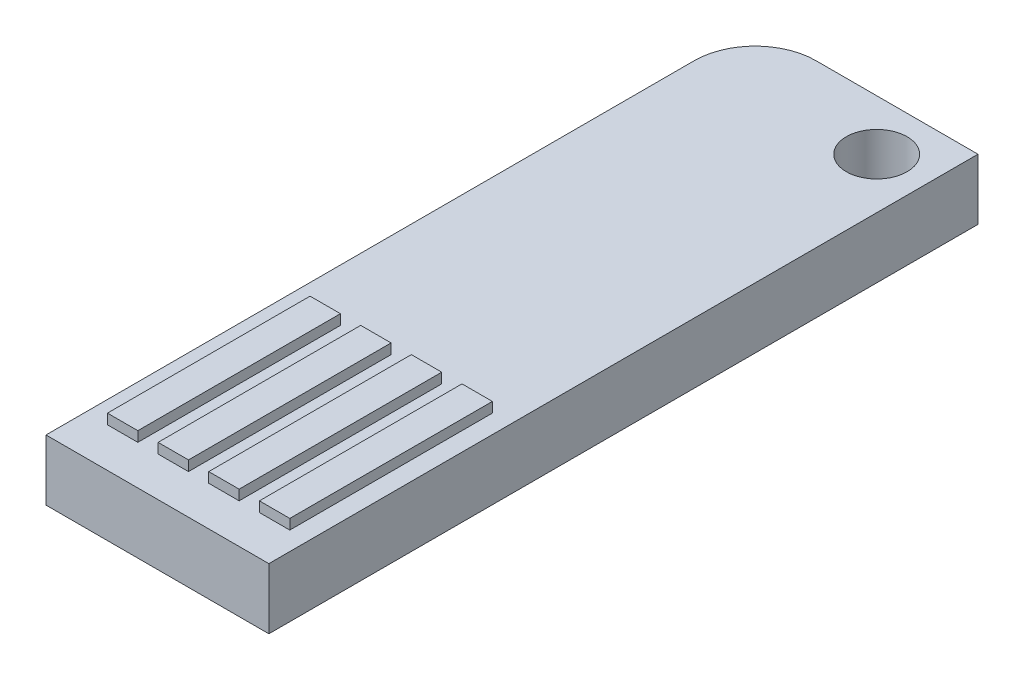
ISO-10303-21;
HEADER;
FILE_DESCRIPTION(('STEP AP214'),'2;1');
FILE_NAME('part.step','',(''),(''),'','','');
FILE_SCHEMA(('AUTOMOTIVE_DESIGN { 1 0 10303 214 1 1 1 1 }'));
ENDSEC;
DATA;
#1=APPLICATION_CONTEXT('core data for automotive mechanical design processes');
#2=APPLICATION_PROTOCOL_DEFINITION('international standard','automotive_design',2000,#1);
#3=PRODUCT_CONTEXT('',#1,'mechanical');
#4=PRODUCT('Part','Part','',(#3));
#5=PRODUCT_RELATED_PRODUCT_CATEGORY('part','',(#4));
#6=PRODUCT_DEFINITION_FORMATION('','',#4);
#7=PRODUCT_DEFINITION_CONTEXT('part definition',#1,'design');
#8=PRODUCT_DEFINITION('design','',#6,#7);
#9=PRODUCT_DEFINITION_SHAPE('','',#8);
#10=(LENGTH_UNIT() NAMED_UNIT(*) SI_UNIT(.MILLI.,.METRE.));
#11=(NAMED_UNIT(*) PLANE_ANGLE_UNIT() SI_UNIT($,.RADIAN.));
#12=(NAMED_UNIT(*) SI_UNIT($,.STERADIAN.) SOLID_ANGLE_UNIT());
#13=UNCERTAINTY_MEASURE_WITH_UNIT(LENGTH_MEASURE(1.E-05),#10,'distance_accuracy_value','');
#14=(GEOMETRIC_REPRESENTATION_CONTEXT(3) GLOBAL_UNCERTAINTY_ASSIGNED_CONTEXT((#13)) GLOBAL_UNIT_ASSIGNED_CONTEXT((#10,
#11,#12)) REPRESENTATION_CONTEXT('',''));
#15=CARTESIAN_POINT('',(0.,0.,0.));
#16=DIRECTION('',(0.,0.,1.));
#17=DIRECTION('',(1.,0.,0.));
#18=AXIS2_PLACEMENT_3D('',#15,#16,#17);
#19=CARTESIAN_POINT('',(0.,3.,0.));
#20=DIRECTION('',(0.,1.,0.));
#21=DIRECTION('',(0.,0.,1.));
#22=AXIS2_PLACEMENT_3D('',#19,#20,#21);
#23=PLANE('',#22);
#24=CARTESIAN_POINT('',(3.0000000000003,3.,-15.0000000000003));
#25=DIRECTION('',(0.,1.,0.));
#26=DIRECTION('',(0.,0.,1.));
#27=AXIS2_PLACEMENT_3D('',#24,#25,#26);
#28=CIRCLE('',#27,1.5);
#29=CARTESIAN_POINT('',(3.0000000000003,3.,-13.5000000000003));
#30=VERTEX_POINT('',#29);
#31=EDGE_CURVE('E290',#30,#30,#28,.T.);
#32=ORIENTED_EDGE('',*,*,#31,.F.);
#33=EDGE_LOOP('',(#32));
#34=FACE_BOUND('',#33,.T.);
#35=DIRECTION('',(-1.,0.,0.));
#36=VECTOR('',#35,1.);
#37=CARTESIAN_POINT('',(-5.50000000000001,3.,-17.5));
#38=LINE('',#37,#36);
#39=CARTESIAN_POINT('',(5.49999999999999,3.,-17.5));
#40=VERTEX_POINT('',#39);
#41=CARTESIAN_POINT('',(-2.50000000000001,3.,-17.5));
#42=VERTEX_POINT('',#41);
#43=EDGE_CURVE('E300',#40,#42,#38,.T.);
#44=ORIENTED_EDGE('',*,*,#43,.T.);
#45=CARTESIAN_POINT('',(-2.50000000000001,3.,-14.5));
#46=DIRECTION('',(0.,1.,0.));
#47=DIRECTION('',(0.,0.,1.));
#48=AXIS2_PLACEMENT_3D('',#45,#46,#47);
#49=CIRCLE('',#48,3.);
#50=CARTESIAN_POINT('',(-5.50000000000001,3.,-14.5));
#51=VERTEX_POINT('',#50);
#52=EDGE_CURVE('E11',#42,#51,#49,.T.);
#53=ORIENTED_EDGE('',*,*,#52,.T.);
#54=DIRECTION('',(0.,0.,1.));
#55=VECTOR('',#54,1.);
#56=CARTESIAN_POINT('',(-5.50000000000001,3.,-17.5));
#57=LINE('',#56,#55);
#58=CARTESIAN_POINT('',(-5.5,3.,17.5));
#59=VERTEX_POINT('',#58);
#60=EDGE_CURVE('E304',#51,#59,#57,.T.);
#61=ORIENTED_EDGE('',*,*,#60,.T.);
#62=DIRECTION('',(1.,0.,0.));
#63=VECTOR('',#62,1.);
#64=CARTESIAN_POINT('',(-5.5,3.,17.5));
#65=LINE('',#64,#63);
#66=CARTESIAN_POINT('',(5.5,3.,17.5));
#67=VERTEX_POINT('',#66);
#68=EDGE_CURVE('E306',#59,#67,#65,.T.);
#69=ORIENTED_EDGE('',*,*,#68,.T.);
#70=DIRECTION('',(0.,0.,-1.));
#71=VECTOR('',#70,1.);
#72=CARTESIAN_POINT('',(5.49999999999999,3.,-17.5));
#73=LINE('',#72,#71);
#74=EDGE_CURVE('E297',#67,#40,#73,.T.);
#75=ORIENTED_EDGE('',*,*,#74,.T.);
#76=EDGE_LOOP('',(#44,#53,#61,#69,#75));
#77=FACE_BOUND('',#76,.T.);
#78=DIRECTION('',(-1.,0.,0.));
#79=VECTOR('',#78,1.);
#80=CARTESIAN_POINT('',(-4.41748166259169,3.,5.55012224938875));
#81=LINE('',#80,#79);
#82=CARTESIAN_POINT('',(-2.91748166259169,3.,5.55012224938875));
#83=VERTEX_POINT('',#82);
#84=CARTESIAN_POINT('',(-4.41748166259169,3.,5.55012224938875));
#85=VERTEX_POINT('',#84);
#86=EDGE_CURVE('E275',#83,#85,#81,.T.);
#87=ORIENTED_EDGE('',*,*,#86,.F.);
#88=DIRECTION('',(0.,0.,-1.));
#89=VECTOR('',#88,1.);
#90=CARTESIAN_POINT('',(-2.91748166259169,3.,5.55012224938875));
#91=LINE('',#90,#89);
#92=CARTESIAN_POINT('',(-2.91748166259169,3.,15.5501222493888));
#93=VERTEX_POINT('',#92);
#94=EDGE_CURVE('E261',#93,#83,#91,.T.);
#95=ORIENTED_EDGE('',*,*,#94,.F.);
#96=DIRECTION('',(1.,0.,0.));
#97=VECTOR('',#96,1.);
#98=CARTESIAN_POINT('',(-4.41748166259169,3.,15.5501222493888));
#99=LINE('',#98,#97);
#100=CARTESIAN_POINT('',(-4.41748166259169,3.,15.5501222493888));
#101=VERTEX_POINT('',#100);
#102=EDGE_CURVE('E266',#101,#93,#99,.T.);
#103=ORIENTED_EDGE('',*,*,#102,.F.);
#104=DIRECTION('',(0.,0.,1.));
#105=VECTOR('',#104,1.);
#106=CARTESIAN_POINT('',(-4.41748166259169,3.,5.55012224938875));
#107=LINE('',#106,#105);
#108=EDGE_CURVE('E277',#85,#101,#107,.T.);
#109=ORIENTED_EDGE('',*,*,#108,.F.);
#110=EDGE_LOOP('',(#87,#95,#103,#109));
#111=FACE_BOUND('',#110,.T.);
#112=DIRECTION('',(0.,0.,-1.));
#113=VECTOR('',#112,1.);
#114=CARTESIAN_POINT('',(-0.417481662591692,3.,5.55012224938875));
#115=LINE('',#114,#113);
#116=CARTESIAN_POINT('',(-0.41748166259169,3.,15.5501222493888));
#117=VERTEX_POINT('',#116);
#118=CARTESIAN_POINT('',(-0.417481662591692,3.,5.55012224938875));
#119=VERTEX_POINT('',#118);
#120=EDGE_CURVE('E246',#117,#119,#115,.T.);
#121=ORIENTED_EDGE('',*,*,#120,.F.);
#122=DIRECTION('',(1.,0.,0.));
#123=VECTOR('',#122,1.);
#124=CARTESIAN_POINT('',(-1.91748166259169,3.,15.5501222493888));
#125=LINE('',#124,#123);
#126=CARTESIAN_POINT('',(-1.91748166259169,3.,15.5501222493888));
#127=VERTEX_POINT('',#126);
#128=EDGE_CURVE('E232',#127,#117,#125,.T.);
#129=ORIENTED_EDGE('',*,*,#128,.F.);
#130=DIRECTION('',(0.,0.,1.));
#131=VECTOR('',#130,1.);
#132=CARTESIAN_POINT('',(-1.91748166259169,3.,5.55012224938875));
#133=LINE('',#132,#131);
#134=CARTESIAN_POINT('',(-1.91748166259169,3.,5.55012224938875));
#135=VERTEX_POINT('',#134);
#136=EDGE_CURVE('E237',#135,#127,#133,.T.);
#137=ORIENTED_EDGE('',*,*,#136,.F.);
#138=DIRECTION('',(-1.,0.,0.));
#139=VECTOR('',#138,1.);
#140=CARTESIAN_POINT('',(-1.91748166259169,3.,5.55012224938875));
#141=LINE('',#140,#139);
#142=EDGE_CURVE('E248',#119,#135,#141,.T.);
#143=ORIENTED_EDGE('',*,*,#142,.F.);
#144=EDGE_LOOP('',(#121,#129,#137,#143));
#145=FACE_BOUND('',#144,.T.);
#146=DIRECTION('',(0.,0.,-1.));
#147=VECTOR('',#146,1.);
#148=CARTESIAN_POINT('',(2.08251833740831,3.,5.55012224938875));
#149=LINE('',#148,#147);
#150=CARTESIAN_POINT('',(2.08251833740831,3.,15.5501222493888));
#151=VERTEX_POINT('',#150);
#152=CARTESIAN_POINT('',(2.08251833740831,3.,5.55012224938875));
#153=VERTEX_POINT('',#152);
#154=EDGE_CURVE('E204',#151,#153,#149,.T.);
#155=ORIENTED_EDGE('',*,*,#154,.F.);
#156=DIRECTION('',(1.,0.,0.));
#157=VECTOR('',#156,1.);
#158=CARTESIAN_POINT('',(0.582518337408309,3.,15.5501222493888));
#159=LINE('',#158,#157);
#160=CARTESIAN_POINT('',(0.582518337408309,3.,15.5501222493888));
#161=VERTEX_POINT('',#160);
#162=EDGE_CURVE('E201',#161,#151,#159,.T.);
#163=ORIENTED_EDGE('',*,*,#162,.F.);
#164=DIRECTION('',(0.,0.,1.));
#165=VECTOR('',#164,1.);
#166=CARTESIAN_POINT('',(0.582518337408308,3.,5.55012224938875));
#167=LINE('',#166,#165);
#168=CARTESIAN_POINT('',(0.582518337408308,3.,5.55012224938875));
#169=VERTEX_POINT('',#168);
#170=EDGE_CURVE('E213',#169,#161,#167,.T.);
#171=ORIENTED_EDGE('',*,*,#170,.F.);
#172=DIRECTION('',(-1.,0.,0.));
#173=VECTOR('',#172,1.);
#174=CARTESIAN_POINT('',(0.582518337408308,3.,5.55012224938875));
#175=LINE('',#174,#173);
#176=EDGE_CURVE('E221',#153,#169,#175,.T.);
#177=ORIENTED_EDGE('',*,*,#176,.F.);
#178=EDGE_LOOP('',(#155,#163,#171,#177));
#179=FACE_BOUND('',#178,.T.);
#180=DIRECTION('',(0.,0.,-1.));
#181=VECTOR('',#180,1.);
#182=CARTESIAN_POINT('',(4.58251833740831,3.,5.55012224938875));
#183=LINE('',#182,#181);
#184=CARTESIAN_POINT('',(4.58251833740831,3.,15.5501222493888));
#185=VERTEX_POINT('',#184);
#186=CARTESIAN_POINT('',(4.58251833740831,3.,5.55012224938875));
#187=VERTEX_POINT('',#186);
#188=EDGE_CURVE('E619',#185,#187,#183,.T.);
#189=ORIENTED_EDGE('',*,*,#188,.F.);
#190=DIRECTION('',(1.,0.,0.));
#191=VECTOR('',#190,1.);
#192=CARTESIAN_POINT('',(3.08251833740831,3.,15.5501222493888));
#193=LINE('',#192,#191);
#194=CARTESIAN_POINT('',(3.08251833740831,3.,15.5501222493888));
#195=VERTEX_POINT('',#194);
#196=EDGE_CURVE('E199',#195,#185,#193,.T.);
#197=ORIENTED_EDGE('',*,*,#196,.F.);
#198=DIRECTION('',(0.,0.,1.));
#199=VECTOR('',#198,1.);
#200=CARTESIAN_POINT('',(3.08251833740831,3.,5.55012224938875));
#201=LINE('',#200,#199);
#202=CARTESIAN_POINT('',(3.08251833740831,3.,5.55012224938875));
#203=VERTEX_POINT('',#202);
#204=EDGE_CURVE('E195',#203,#195,#201,.T.);
#205=ORIENTED_EDGE('',*,*,#204,.F.);
#206=DIRECTION('',(-1.,0.,0.));
#207=VECTOR('',#206,1.);
#208=CARTESIAN_POINT('',(3.08251833740831,3.,5.55012224938875));
#209=LINE('',#208,#207);
#210=EDGE_CURVE('E616',#187,#203,#209,.T.);
#211=ORIENTED_EDGE('',*,*,#210,.F.);
#212=EDGE_LOOP('',(#189,#197,#205,#211));
#213=FACE_BOUND('',#212,.T.);
#214=ADVANCED_FACE('F33',(#34,#77,#111,#145,#179,#213),#23,.T.);
#215=CARTESIAN_POINT('',(5.49999999999999,3.,-17.5));
#216=DIRECTION('',(-1.,0.,0.));
#217=DIRECTION('',(0.,0.,1.));
#218=AXIS2_PLACEMENT_3D('',#215,#216,#217);
#219=PLANE('',#218);
#220=DIRECTION('',(0.,0.,-1.));
#221=VECTOR('',#220,1.);
#222=CARTESIAN_POINT('',(5.49999999999999,0.,-17.5));
#223=LINE('',#222,#221);
#224=CARTESIAN_POINT('',(5.5,0.,17.5));
#225=VERTEX_POINT('',#224);
#226=CARTESIAN_POINT('',(5.49999999999999,0.,-17.5));
#227=VERTEX_POINT('',#226);
#228=EDGE_CURVE('E294',#225,#227,#223,.T.);
#229=ORIENTED_EDGE('',*,*,#228,.T.);
#230=DIRECTION('',(0.,-1.,0.));
#231=VECTOR('',#230,1.);
#232=CARTESIAN_POINT('',(5.49999999999999,3.,-17.5));
#233=LINE('',#232,#231);
#234=EDGE_CURVE('E322',#40,#227,#233,.T.);
#235=ORIENTED_EDGE('',*,*,#234,.F.);
#236=ORIENTED_EDGE('',*,*,#74,.F.);
#237=DIRECTION('',(0.,-1.,0.));
#238=VECTOR('',#237,1.);
#239=CARTESIAN_POINT('',(5.5,3.,17.5));
#240=LINE('',#239,#238);
#241=EDGE_CURVE('E308',#67,#225,#240,.T.);
#242=ORIENTED_EDGE('',*,*,#241,.T.);
#243=EDGE_LOOP('',(#229,#235,#236,#242));
#244=FACE_BOUND('',#243,.T.);
#245=ADVANCED_FACE('F353',(#244),#219,.F.);
#246=CARTESIAN_POINT('',(-5.50000000000001,3.,-17.5));
#247=DIRECTION('',(0.,0.,1.));
#248=DIRECTION('',(1.,0.,0.));
#249=AXIS2_PLACEMENT_3D('',#246,#247,#248);
#250=PLANE('',#249);
#251=DIRECTION('',(-1.,0.,0.));
#252=VECTOR('',#251,1.);
#253=CARTESIAN_POINT('',(-5.50000000000001,0.,-17.5));
#254=LINE('',#253,#252);
#255=CARTESIAN_POINT('',(-2.50000000000001,0.,-17.5));
#256=VERTEX_POINT('',#255);
#257=EDGE_CURVE('E311',#227,#256,#254,.T.);
#258=ORIENTED_EDGE('',*,*,#257,.T.);
#259=DIRECTION('',(0.,-1.,0.));
#260=VECTOR('',#259,1.);
#261=CARTESIAN_POINT('',(-2.50000000000001,3.,-17.5));
#262=LINE('',#261,#260);
#263=EDGE_CURVE('E41',#256,#42,#262,.F.);
#264=ORIENTED_EDGE('',*,*,#263,.T.);
#265=ORIENTED_EDGE('',*,*,#43,.F.);
#266=ORIENTED_EDGE('',*,*,#234,.T.);
#267=EDGE_LOOP('',(#258,#264,#265,#266));
#268=FACE_BOUND('',#267,.T.);
#269=ADVANCED_FACE('F331',(#268),#250,.F.);
#270=CARTESIAN_POINT('',(-5.50000000000001,3.,-17.5));
#271=DIRECTION('',(1.,0.,0.));
#272=DIRECTION('',(0.,0.,-1.));
#273=AXIS2_PLACEMENT_3D('',#270,#271,#272);
#274=PLANE('',#273);
#275=ORIENTED_EDGE('',*,*,#60,.F.);
#276=DIRECTION('',(0.,-1.,0.));
#277=VECTOR('',#276,1.);
#278=CARTESIAN_POINT('',(-5.50000000000001,3.,-14.5));
#279=LINE('',#278,#277);
#280=CARTESIAN_POINT('',(-5.50000000000001,0.,-14.5));
#281=VERTEX_POINT('',#280);
#282=EDGE_CURVE('E325',#51,#281,#279,.T.);
#283=ORIENTED_EDGE('',*,*,#282,.T.);
#284=DIRECTION('',(0.,0.,1.));
#285=VECTOR('',#284,1.);
#286=CARTESIAN_POINT('',(-5.50000000000001,0.,-17.5));
#287=LINE('',#286,#285);
#288=CARTESIAN_POINT('',(-5.5,0.,17.5));
#289=VERTEX_POINT('',#288);
#290=EDGE_CURVE('E314',#281,#289,#287,.T.);
#291=ORIENTED_EDGE('',*,*,#290,.T.);
#292=DIRECTION('',(0.,-1.,0.));
#293=VECTOR('',#292,1.);
#294=CARTESIAN_POINT('',(-5.5,3.,17.5));
#295=LINE('',#294,#293);
#296=EDGE_CURVE('E319',#59,#289,#295,.T.);
#297=ORIENTED_EDGE('',*,*,#296,.F.);
#298=EDGE_LOOP('',(#275,#283,#291,#297));
#299=FACE_BOUND('',#298,.T.);
#300=ADVANCED_FACE('F342',(#299),#274,.F.);
#301=CARTESIAN_POINT('',(-5.5,3.,17.5));
#302=DIRECTION('',(0.,0.,-1.));
#303=DIRECTION('',(-1.,0.,0.));
#304=AXIS2_PLACEMENT_3D('',#301,#302,#303);
#305=PLANE('',#304);
#306=DIRECTION('',(1.,0.,0.));
#307=VECTOR('',#306,1.);
#308=CARTESIAN_POINT('',(-5.5,0.,17.5));
#309=LINE('',#308,#307);
#310=EDGE_CURVE('E301',#289,#225,#309,.T.);
#311=ORIENTED_EDGE('',*,*,#310,.T.);
#312=ORIENTED_EDGE('',*,*,#241,.F.);
#313=ORIENTED_EDGE('',*,*,#68,.F.);
#314=ORIENTED_EDGE('',*,*,#296,.T.);
#315=EDGE_LOOP('',(#311,#312,#313,#314));
#316=FACE_BOUND('',#315,.T.);
#317=ADVANCED_FACE('F350',(#316),#305,.F.);
#318=CARTESIAN_POINT('',(0.,0.,0.));
#319=DIRECTION('',(0.,1.,0.));
#320=DIRECTION('',(0.,0.,1.));
#321=AXIS2_PLACEMENT_3D('',#318,#319,#320);
#322=PLANE('',#321);
#323=CARTESIAN_POINT('',(3.0000000000003,0.,-15.0000000000003));
#324=DIRECTION('',(0.,1.,0.));
#325=DIRECTION('',(0.,0.,1.));
#326=AXIS2_PLACEMENT_3D('',#323,#324,#325);
#327=CIRCLE('',#326,1.5);
#328=CARTESIAN_POINT('',(3.0000000000003,0.,-13.5000000000003));
#329=VERTEX_POINT('',#328);
#330=EDGE_CURVE('E291',#329,#329,#327,.T.);
#331=ORIENTED_EDGE('',*,*,#330,.T.);
#332=EDGE_LOOP('',(#331));
#333=FACE_BOUND('',#332,.T.);
#334=ORIENTED_EDGE('',*,*,#290,.F.);
#335=CARTESIAN_POINT('',(-2.50000000000001,0.,-14.5));
#336=DIRECTION('',(0.,1.,0.));
#337=DIRECTION('',(0.,0.,1.));
#338=AXIS2_PLACEMENT_3D('',#335,#336,#337);
#339=CIRCLE('',#338,3.);
#340=EDGE_CURVE('E328',#281,#256,#339,.F.);
#341=ORIENTED_EDGE('',*,*,#340,.T.);
#342=ORIENTED_EDGE('',*,*,#257,.F.);
#343=ORIENTED_EDGE('',*,*,#228,.F.);
#344=ORIENTED_EDGE('',*,*,#310,.F.);
#345=EDGE_LOOP('',(#334,#341,#342,#343,#344));
#346=FACE_BOUND('',#345,.T.);
#347=ADVANCED_FACE('F346',(#333,#346),#322,.F.);
#348=CARTESIAN_POINT('',(3.0000000000003,0.,-15.0000000000003));
#349=DIRECTION('',(0.,1.,0.));
#350=DIRECTION('',(0.,0.,1.));
#351=AXIS2_PLACEMENT_3D('',#348,#349,#350);
#352=CYLINDRICAL_SURFACE('',#351,1.5);
#353=ORIENTED_EDGE('',*,*,#330,.F.);
#354=EDGE_LOOP('',(#353));
#355=FACE_BOUND('',#354,.T.);
#356=ORIENTED_EDGE('',*,*,#31,.T.);
#357=EDGE_LOOP('',(#356));
#358=FACE_BOUND('',#357,.T.);
#359=ADVANCED_FACE('F369',(#355,#358),#352,.F.);
#360=CARTESIAN_POINT('',(-2.50000000000001,3.,-14.5));
#361=DIRECTION('',(0.,-1.,0.));
#362=DIRECTION('',(0.,0.,-1.));
#363=AXIS2_PLACEMENT_3D('',#360,#361,#362);
#364=CYLINDRICAL_SURFACE('',#363,3.);
#365=ORIENTED_EDGE('',*,*,#52,.F.);
#366=ORIENTED_EDGE('',*,*,#263,.F.);
#367=ORIENTED_EDGE('',*,*,#340,.F.);
#368=ORIENTED_EDGE('',*,*,#282,.F.);
#369=EDGE_LOOP('',(#365,#366,#367,#368));
#370=FACE_BOUND('',#369,.T.);
#371=ADVANCED_FACE('F35',(#370),#364,.T.);
#372=CARTESIAN_POINT('',(-2.91748166259169,3.5,5.55012224938875));
#373=DIRECTION('',(-1.,0.,0.));
#374=DIRECTION('',(0.,0.,1.));
#375=AXIS2_PLACEMENT_3D('',#372,#373,#374);
#376=PLANE('',#375);
#377=ORIENTED_EDGE('',*,*,#94,.T.);
#378=DIRECTION('',(0.,-1.,0.));
#379=VECTOR('',#378,1.);
#380=CARTESIAN_POINT('',(-2.91748166259169,3.5,5.55012224938875));
#381=LINE('',#380,#379);
#382=CARTESIAN_POINT('',(-2.91748166259169,3.5,5.55012224938875));
#383=VERTEX_POINT('',#382);
#384=EDGE_CURVE('E288',#383,#83,#381,.T.);
#385=ORIENTED_EDGE('',*,*,#384,.F.);
#386=DIRECTION('',(0.,0.,-1.));
#387=VECTOR('',#386,1.);
#388=CARTESIAN_POINT('',(-2.91748166259169,3.5,5.55012224938875));
#389=LINE('',#388,#387);
#390=CARTESIAN_POINT('',(-2.91748166259169,3.5,15.5501222493888));
#391=VERTEX_POINT('',#390);
#392=EDGE_CURVE('E262',#391,#383,#389,.T.);
#393=ORIENTED_EDGE('',*,*,#392,.F.);
#394=DIRECTION('',(0.,-1.,0.));
#395=VECTOR('',#394,1.);
#396=CARTESIAN_POINT('',(-2.91748166259169,3.5,15.5501222493888));
#397=LINE('',#396,#395);
#398=EDGE_CURVE('E272',#391,#93,#397,.T.);
#399=ORIENTED_EDGE('',*,*,#398,.T.);
#400=EDGE_LOOP('',(#377,#385,#393,#399));
#401=FACE_BOUND('',#400,.T.);
#402=ADVANCED_FACE('F375',(#401),#376,.F.);
#403=CARTESIAN_POINT('',(-4.41748166259169,3.5,5.55012224938875));
#404=DIRECTION('',(0.,0.,1.));
#405=DIRECTION('',(1.,0.,0.));
#406=AXIS2_PLACEMENT_3D('',#403,#404,#405);
#407=PLANE('',#406);
#408=ORIENTED_EDGE('',*,*,#86,.T.);
#409=DIRECTION('',(0.,-1.,0.));
#410=VECTOR('',#409,1.);
#411=CARTESIAN_POINT('',(-4.41748166259169,3.5,5.55012224938875));
#412=LINE('',#411,#410);
#413=CARTESIAN_POINT('',(-4.41748166259169,3.5,5.55012224938875));
#414=VERTEX_POINT('',#413);
#415=EDGE_CURVE('E285',#414,#85,#412,.T.);
#416=ORIENTED_EDGE('',*,*,#415,.F.);
#417=DIRECTION('',(-1.,0.,0.));
#418=VECTOR('',#417,1.);
#419=CARTESIAN_POINT('',(-4.41748166259169,3.5,5.55012224938875));
#420=LINE('',#419,#418);
#421=EDGE_CURVE('E265',#383,#414,#420,.T.);
#422=ORIENTED_EDGE('',*,*,#421,.F.);
#423=ORIENTED_EDGE('',*,*,#384,.T.);
#424=EDGE_LOOP('',(#408,#416,#422,#423));
#425=FACE_BOUND('',#424,.T.);
#426=ADVANCED_FACE('F378',(#425),#407,.F.);
#427=CARTESIAN_POINT('',(-4.41748166259169,3.5,5.55012224938875));
#428=DIRECTION('',(1.,0.,0.));
#429=DIRECTION('',(0.,0.,-1.));
#430=AXIS2_PLACEMENT_3D('',#427,#428,#429);
#431=PLANE('',#430);
#432=ORIENTED_EDGE('',*,*,#108,.T.);
#433=DIRECTION('',(0.,-1.,0.));
#434=VECTOR('',#433,1.);
#435=CARTESIAN_POINT('',(-4.41748166259169,3.5,15.5501222493888));
#436=LINE('',#435,#434);
#437=CARTESIAN_POINT('',(-4.41748166259169,3.5,15.5501222493888));
#438=VERTEX_POINT('',#437);
#439=EDGE_CURVE('E283',#438,#101,#436,.T.);
#440=ORIENTED_EDGE('',*,*,#439,.F.);
#441=DIRECTION('',(0.,0.,1.));
#442=VECTOR('',#441,1.);
#443=CARTESIAN_POINT('',(-4.41748166259169,3.5,5.55012224938875));
#444=LINE('',#443,#442);
#445=EDGE_CURVE('E268',#414,#438,#444,.T.);
#446=ORIENTED_EDGE('',*,*,#445,.F.);
#447=ORIENTED_EDGE('',*,*,#415,.T.);
#448=EDGE_LOOP('',(#432,#440,#446,#447));
#449=FACE_BOUND('',#448,.T.);
#450=ADVANCED_FACE('F382',(#449),#431,.F.);
#451=CARTESIAN_POINT('',(-4.41748166259169,3.5,15.5501222493888));
#452=DIRECTION('',(0.,0.,-1.));
#453=DIRECTION('',(-1.,0.,0.));
#454=AXIS2_PLACEMENT_3D('',#451,#452,#453);
#455=PLANE('',#454);
#456=ORIENTED_EDGE('',*,*,#102,.T.);
#457=ORIENTED_EDGE('',*,*,#398,.F.);
#458=DIRECTION('',(1.,0.,0.));
#459=VECTOR('',#458,1.);
#460=CARTESIAN_POINT('',(-4.41748166259169,3.5,15.5501222493888));
#461=LINE('',#460,#459);
#462=EDGE_CURVE('E270',#438,#391,#461,.T.);
#463=ORIENTED_EDGE('',*,*,#462,.F.);
#464=ORIENTED_EDGE('',*,*,#439,.T.);
#465=EDGE_LOOP('',(#456,#457,#463,#464));
#466=FACE_BOUND('',#465,.T.);
#467=ADVANCED_FACE('F386',(#466),#455,.F.);
#468=CARTESIAN_POINT('',(0.,3.5,0.));
#469=DIRECTION('',(0.,1.,0.));
#470=DIRECTION('',(0.,0.,1.));
#471=AXIS2_PLACEMENT_3D('',#468,#469,#470);
#472=PLANE('',#471);
#473=ORIENTED_EDGE('',*,*,#392,.T.);
#474=ORIENTED_EDGE('',*,*,#421,.T.);
#475=ORIENTED_EDGE('',*,*,#445,.T.);
#476=ORIENTED_EDGE('',*,*,#462,.T.);
#477=EDGE_LOOP('',(#473,#474,#475,#476));
#478=FACE_BOUND('',#477,.T.);
#479=ADVANCED_FACE('F390',(#478),#472,.T.);
#480=CARTESIAN_POINT('',(-1.91748166259169,3.5,15.5501222493888));
#481=DIRECTION('',(0.,0.,-1.));
#482=DIRECTION('',(-1.,0.,0.));
#483=AXIS2_PLACEMENT_3D('',#480,#481,#482);
#484=PLANE('',#483);
#485=ORIENTED_EDGE('',*,*,#128,.T.);
#486=DIRECTION('',(0.,-1.,0.));
#487=VECTOR('',#486,1.);
#488=CARTESIAN_POINT('',(-0.41748166259169,3.5,15.5501222493888));
#489=LINE('',#488,#487);
#490=CARTESIAN_POINT('',(-0.41748166259169,3.5,15.5501222493888));
#491=VERTEX_POINT('',#490);
#492=EDGE_CURVE('E259',#491,#117,#489,.T.);
#493=ORIENTED_EDGE('',*,*,#492,.F.);
#494=DIRECTION('',(1.,0.,0.));
#495=VECTOR('',#494,1.);
#496=CARTESIAN_POINT('',(-1.91748166259169,3.5,15.5501222493888));
#497=LINE('',#496,#495);
#498=CARTESIAN_POINT('',(-1.91748166259169,3.5,15.5501222493888));
#499=VERTEX_POINT('',#498);
#500=EDGE_CURVE('E233',#499,#491,#497,.T.);
#501=ORIENTED_EDGE('',*,*,#500,.F.);
#502=DIRECTION('',(0.,-1.,0.));
#503=VECTOR('',#502,1.);
#504=CARTESIAN_POINT('',(-1.91748166259169,3.5,15.5501222493888));
#505=LINE('',#504,#503);
#506=EDGE_CURVE('E243',#499,#127,#505,.T.);
#507=ORIENTED_EDGE('',*,*,#506,.T.);
#508=EDGE_LOOP('',(#485,#493,#501,#507));
#509=FACE_BOUND('',#508,.T.);
#510=ADVANCED_FACE('F394',(#509),#484,.F.);
#511=CARTESIAN_POINT('',(-0.417481662591692,3.5,5.55012224938875));
#512=DIRECTION('',(-1.,0.,0.));
#513=DIRECTION('',(0.,0.,1.));
#514=AXIS2_PLACEMENT_3D('',#511,#512,#513);
#515=PLANE('',#514);
#516=ORIENTED_EDGE('',*,*,#120,.T.);
#517=DIRECTION('',(0.,-1.,0.));
#518=VECTOR('',#517,1.);
#519=CARTESIAN_POINT('',(-0.417481662591692,3.5,5.55012224938875));
#520=LINE('',#519,#518);
#521=CARTESIAN_POINT('',(-0.417481662591692,3.5,5.55012224938875));
#522=VERTEX_POINT('',#521);
#523=EDGE_CURVE('E256',#522,#119,#520,.T.);
#524=ORIENTED_EDGE('',*,*,#523,.F.);
#525=DIRECTION('',(0.,0.,-1.));
#526=VECTOR('',#525,1.);
#527=CARTESIAN_POINT('',(-0.417481662591692,3.5,5.55012224938875));
#528=LINE('',#527,#526);
#529=EDGE_CURVE('E236',#491,#522,#528,.T.);
#530=ORIENTED_EDGE('',*,*,#529,.F.);
#531=ORIENTED_EDGE('',*,*,#492,.T.);
#532=EDGE_LOOP('',(#516,#524,#530,#531));
#533=FACE_BOUND('',#532,.T.);
#534=ADVANCED_FACE('F398',(#533),#515,.F.);
#535=CARTESIAN_POINT('',(-1.91748166259169,3.5,5.55012224938875));
#536=DIRECTION('',(0.,0.,1.));
#537=DIRECTION('',(1.,0.,0.));
#538=AXIS2_PLACEMENT_3D('',#535,#536,#537);
#539=PLANE('',#538);
#540=ORIENTED_EDGE('',*,*,#142,.T.);
#541=DIRECTION('',(0.,-1.,0.));
#542=VECTOR('',#541,1.);
#543=CARTESIAN_POINT('',(-1.91748166259169,3.5,5.55012224938875));
#544=LINE('',#543,#542);
#545=CARTESIAN_POINT('',(-1.91748166259169,3.5,5.55012224938875));
#546=VERTEX_POINT('',#545);
#547=EDGE_CURVE('E254',#546,#135,#544,.T.);
#548=ORIENTED_EDGE('',*,*,#547,.F.);
#549=DIRECTION('',(-1.,0.,0.));
#550=VECTOR('',#549,1.);
#551=CARTESIAN_POINT('',(-1.91748166259169,3.5,5.55012224938875));
#552=LINE('',#551,#550);
#553=EDGE_CURVE('E239',#522,#546,#552,.T.);
#554=ORIENTED_EDGE('',*,*,#553,.F.);
#555=ORIENTED_EDGE('',*,*,#523,.T.);
#556=EDGE_LOOP('',(#540,#548,#554,#555));
#557=FACE_BOUND('',#556,.T.);
#558=ADVANCED_FACE('F402',(#557),#539,.F.);
#559=CARTESIAN_POINT('',(-1.91748166259169,3.5,5.55012224938875));
#560=DIRECTION('',(1.,0.,0.));
#561=DIRECTION('',(0.,0.,-1.));
#562=AXIS2_PLACEMENT_3D('',#559,#560,#561);
#563=PLANE('',#562);
#564=ORIENTED_EDGE('',*,*,#136,.T.);
#565=ORIENTED_EDGE('',*,*,#506,.F.);
#566=DIRECTION('',(0.,0.,1.));
#567=VECTOR('',#566,1.);
#568=CARTESIAN_POINT('',(-1.91748166259169,3.5,5.55012224938875));
#569=LINE('',#568,#567);
#570=EDGE_CURVE('E241',#546,#499,#569,.T.);
#571=ORIENTED_EDGE('',*,*,#570,.F.);
#572=ORIENTED_EDGE('',*,*,#547,.T.);
#573=EDGE_LOOP('',(#564,#565,#571,#572));
#574=FACE_BOUND('',#573,.T.);
#575=ADVANCED_FACE('F406',(#574),#563,.F.);
#576=CARTESIAN_POINT('',(0.,3.5,0.));
#577=DIRECTION('',(0.,-1.,0.));
#578=DIRECTION('',(0.,0.,-1.));
#579=AXIS2_PLACEMENT_3D('',#576,#577,#578);
#580=PLANE('',#579);
#581=ORIENTED_EDGE('',*,*,#500,.T.);
#582=ORIENTED_EDGE('',*,*,#529,.T.);
#583=ORIENTED_EDGE('',*,*,#553,.T.);
#584=ORIENTED_EDGE('',*,*,#570,.T.);
#585=EDGE_LOOP('',(#581,#582,#583,#584));
#586=FACE_BOUND('',#585,.T.);
#587=ADVANCED_FACE('F410',(#586),#580,.F.);
#588=CARTESIAN_POINT('',(0.582518337408309,3.5,15.5501222493888));
#589=DIRECTION('',(0.,0.,-1.));
#590=DIRECTION('',(-1.,0.,0.));
#591=AXIS2_PLACEMENT_3D('',#588,#589,#590);
#592=PLANE('',#591);
#593=ORIENTED_EDGE('',*,*,#162,.T.);
#594=DIRECTION('',(0.,-1.,0.));
#595=VECTOR('',#594,1.);
#596=CARTESIAN_POINT('',(2.08251833740831,3.5,15.5501222493888));
#597=LINE('',#596,#595);
#598=CARTESIAN_POINT('',(2.08251833740831,3.5,15.5501222493888));
#599=VERTEX_POINT('',#598);
#600=EDGE_CURVE('E230',#599,#151,#597,.T.);
#601=ORIENTED_EDGE('',*,*,#600,.F.);
#602=DIRECTION('',(1.,0.,0.));
#603=VECTOR('',#602,1.);
#604=CARTESIAN_POINT('',(0.582518337408309,3.5,15.5501222493888));
#605=LINE('',#604,#603);
#606=CARTESIAN_POINT('',(0.582518337408309,3.5,15.5501222493888));
#607=VERTEX_POINT('',#606);
#608=EDGE_CURVE('E209',#607,#599,#605,.T.);
#609=ORIENTED_EDGE('',*,*,#608,.F.);
#610=DIRECTION('',(0.,-1.,0.));
#611=VECTOR('',#610,1.);
#612=CARTESIAN_POINT('',(0.582518337408309,3.5,15.5501222493888));
#613=LINE('',#612,#611);
#614=EDGE_CURVE('E218',#607,#161,#613,.T.);
#615=ORIENTED_EDGE('',*,*,#614,.T.);
#616=EDGE_LOOP('',(#593,#601,#609,#615));
#617=FACE_BOUND('',#616,.T.);
#618=ADVANCED_FACE('F414',(#617),#592,.F.);
#619=CARTESIAN_POINT('',(2.08251833740831,3.5,5.55012224938875));
#620=DIRECTION('',(-1.,0.,0.));
#621=DIRECTION('',(0.,0.,1.));
#622=AXIS2_PLACEMENT_3D('',#619,#620,#621);
#623=PLANE('',#622);
#624=ORIENTED_EDGE('',*,*,#154,.T.);
#625=DIRECTION('',(0.,-1.,0.));
#626=VECTOR('',#625,1.);
#627=CARTESIAN_POINT('',(2.08251833740831,3.5,5.55012224938875));
#628=LINE('',#627,#626);
#629=CARTESIAN_POINT('',(2.08251833740831,3.5,5.55012224938875));
#630=VERTEX_POINT('',#629);
#631=EDGE_CURVE('E227',#630,#153,#628,.T.);
#632=ORIENTED_EDGE('',*,*,#631,.F.);
#633=DIRECTION('',(0.,0.,-1.));
#634=VECTOR('',#633,1.);
#635=CARTESIAN_POINT('',(2.08251833740831,3.5,5.55012224938875));
#636=LINE('',#635,#634);
#637=EDGE_CURVE('E212',#599,#630,#636,.T.);
#638=ORIENTED_EDGE('',*,*,#637,.F.);
#639=ORIENTED_EDGE('',*,*,#600,.T.);
#640=EDGE_LOOP('',(#624,#632,#638,#639));
#641=FACE_BOUND('',#640,.T.);
#642=ADVANCED_FACE('F418',(#641),#623,.F.);
#643=CARTESIAN_POINT('',(0.582518337408308,3.5,5.55012224938875));
#644=DIRECTION('',(0.,0.,1.));
#645=DIRECTION('',(1.,0.,0.));
#646=AXIS2_PLACEMENT_3D('',#643,#644,#645);
#647=PLANE('',#646);
#648=ORIENTED_EDGE('',*,*,#176,.T.);
#649=DIRECTION('',(0.,-1.,0.));
#650=VECTOR('',#649,1.);
#651=CARTESIAN_POINT('',(0.582518337408308,3.5,5.55012224938875));
#652=LINE('',#651,#650);
#653=CARTESIAN_POINT('',(0.582518337408308,3.5,5.55012224938875));
#654=VERTEX_POINT('',#653);
#655=EDGE_CURVE('E56',#654,#169,#652,.T.);
#656=ORIENTED_EDGE('',*,*,#655,.F.);
#657=DIRECTION('',(-1.,0.,0.));
#658=VECTOR('',#657,1.);
#659=CARTESIAN_POINT('',(0.582518337408308,3.5,5.55012224938875));
#660=LINE('',#659,#658);
#661=EDGE_CURVE('E215',#630,#654,#660,.T.);
#662=ORIENTED_EDGE('',*,*,#661,.F.);
#663=ORIENTED_EDGE('',*,*,#631,.T.);
#664=EDGE_LOOP('',(#648,#656,#662,#663));
#665=FACE_BOUND('',#664,.T.);
#666=ADVANCED_FACE('F422',(#665),#647,.F.);
#667=CARTESIAN_POINT('',(0.582518337408308,3.5,5.55012224938875));
#668=DIRECTION('',(1.,0.,0.));
#669=DIRECTION('',(0.,0.,-1.));
#670=AXIS2_PLACEMENT_3D('',#667,#668,#669);
#671=PLANE('',#670);
#672=ORIENTED_EDGE('',*,*,#170,.T.);
#673=ORIENTED_EDGE('',*,*,#614,.F.);
#674=DIRECTION('',(0.,0.,1.));
#675=VECTOR('',#674,1.);
#676=CARTESIAN_POINT('',(0.582518337408308,3.5,5.55012224938875));
#677=LINE('',#676,#675);
#678=EDGE_CURVE('E217',#654,#607,#677,.T.);
#679=ORIENTED_EDGE('',*,*,#678,.F.);
#680=ORIENTED_EDGE('',*,*,#655,.T.);
#681=EDGE_LOOP('',(#672,#673,#679,#680));
#682=FACE_BOUND('',#681,.T.);
#683=ADVANCED_FACE('F426',(#682),#671,.F.);
#684=CARTESIAN_POINT('',(0.,3.5,0.));
#685=DIRECTION('',(0.,-1.,0.));
#686=DIRECTION('',(0.,0.,-1.));
#687=AXIS2_PLACEMENT_3D('',#684,#685,#686);
#688=PLANE('',#687);
#689=ORIENTED_EDGE('',*,*,#608,.T.);
#690=ORIENTED_EDGE('',*,*,#637,.T.);
#691=ORIENTED_EDGE('',*,*,#661,.T.);
#692=ORIENTED_EDGE('',*,*,#678,.T.);
#693=EDGE_LOOP('',(#689,#690,#691,#692));
#694=FACE_BOUND('',#693,.T.);
#695=ADVANCED_FACE('F430',(#694),#688,.F.);
#696=CARTESIAN_POINT('',(3.08251833740831,3.5,15.5501222493888));
#697=DIRECTION('',(0.,0.,-1.));
#698=DIRECTION('',(-1.,0.,0.));
#699=AXIS2_PLACEMENT_3D('',#696,#697,#698);
#700=PLANE('',#699);
#701=ORIENTED_EDGE('',*,*,#196,.T.);
#702=DIRECTION('',(0.,-1.,0.));
#703=VECTOR('',#702,1.);
#704=CARTESIAN_POINT('',(4.58251833740831,3.5,15.5501222493888));
#705=LINE('',#704,#703);
#706=CARTESIAN_POINT('',(4.58251833740831,3.5,15.5501222493888));
#707=VERTEX_POINT('',#706);
#708=EDGE_CURVE('E180',#707,#185,#705,.T.);
#709=ORIENTED_EDGE('',*,*,#708,.F.);
#710=DIRECTION('',(1.,0.,0.));
#711=VECTOR('',#710,1.);
#712=CARTESIAN_POINT('',(3.08251833740831,3.5,15.5501222493888));
#713=LINE('',#712,#711);
#714=CARTESIAN_POINT('',(3.08251833740831,3.5,15.5501222493888));
#715=VERTEX_POINT('',#714);
#716=EDGE_CURVE('E187',#715,#707,#713,.T.);
#717=ORIENTED_EDGE('',*,*,#716,.F.);
#718=DIRECTION('',(0.,-1.,0.));
#719=VECTOR('',#718,1.);
#720=CARTESIAN_POINT('',(3.08251833740831,3.5,15.5501222493888));
#721=LINE('',#720,#719);
#722=EDGE_CURVE('E613',#715,#195,#721,.T.);
#723=ORIENTED_EDGE('',*,*,#722,.T.);
#724=EDGE_LOOP('',(#701,#709,#717,#723));
#725=FACE_BOUND('',#724,.T.);
#726=ADVANCED_FACE('F197',(#725),#700,.F.);
#727=CARTESIAN_POINT('',(4.58251833740831,3.5,5.55012224938875));
#728=DIRECTION('',(-1.,0.,0.));
#729=DIRECTION('',(0.,0.,1.));
#730=AXIS2_PLACEMENT_3D('',#727,#728,#729);
#731=PLANE('',#730);
#732=ORIENTED_EDGE('',*,*,#188,.T.);
#733=DIRECTION('',(0.,-1.,0.));
#734=VECTOR('',#733,1.);
#735=CARTESIAN_POINT('',(4.58251833740831,3.5,5.55012224938875));
#736=LINE('',#735,#734);
#737=CARTESIAN_POINT('',(4.58251833740831,3.5,5.55012224938875));
#738=VERTEX_POINT('',#737);
#739=EDGE_CURVE('E183',#738,#187,#736,.T.);
#740=ORIENTED_EDGE('',*,*,#739,.F.);
#741=DIRECTION('',(0.,0.,-1.));
#742=VECTOR('',#741,1.);
#743=CARTESIAN_POINT('',(4.58251833740831,3.5,5.55012224938875));
#744=LINE('',#743,#742);
#745=EDGE_CURVE('E176',#707,#738,#744,.T.);
#746=ORIENTED_EDGE('',*,*,#745,.F.);
#747=ORIENTED_EDGE('',*,*,#708,.T.);
#748=EDGE_LOOP('',(#732,#740,#746,#747));
#749=FACE_BOUND('',#748,.T.);
#750=ADVANCED_FACE('F178',(#749),#731,.F.);
#751=CARTESIAN_POINT('',(3.08251833740831,3.5,5.55012224938875));
#752=DIRECTION('',(0.,0.,1.));
#753=DIRECTION('',(1.,0.,0.));
#754=AXIS2_PLACEMENT_3D('',#751,#752,#753);
#755=PLANE('',#754);
#756=ORIENTED_EDGE('',*,*,#210,.T.);
#757=DIRECTION('',(0.,-1.,0.));
#758=VECTOR('',#757,1.);
#759=CARTESIAN_POINT('',(3.08251833740831,3.5,5.55012224938875));
#760=LINE('',#759,#758);
#761=CARTESIAN_POINT('',(3.08251833740831,3.5,5.55012224938875));
#762=VERTEX_POINT('',#761);
#763=EDGE_CURVE('E48',#762,#203,#760,.T.);
#764=ORIENTED_EDGE('',*,*,#763,.F.);
#765=DIRECTION('',(-1.,0.,0.));
#766=VECTOR('',#765,1.);
#767=CARTESIAN_POINT('',(3.08251833740831,3.5,5.55012224938875));
#768=LINE('',#767,#766);
#769=EDGE_CURVE('E186',#738,#762,#768,.T.);
#770=ORIENTED_EDGE('',*,*,#769,.F.);
#771=ORIENTED_EDGE('',*,*,#739,.T.);
#772=EDGE_LOOP('',(#756,#764,#770,#771));
#773=FACE_BOUND('',#772,.T.);
#774=ADVANCED_FACE('F438',(#773),#755,.F.);
#775=CARTESIAN_POINT('',(3.08251833740831,3.5,5.55012224938875));
#776=DIRECTION('',(1.,0.,0.));
#777=DIRECTION('',(0.,0.,-1.));
#778=AXIS2_PLACEMENT_3D('',#775,#776,#777);
#779=PLANE('',#778);
#780=ORIENTED_EDGE('',*,*,#204,.T.);
#781=ORIENTED_EDGE('',*,*,#722,.F.);
#782=DIRECTION('',(0.,0.,1.));
#783=VECTOR('',#782,1.);
#784=CARTESIAN_POINT('',(3.08251833740831,3.5,5.55012224938875));
#785=LINE('',#784,#783);
#786=EDGE_CURVE('E191',#762,#715,#785,.T.);
#787=ORIENTED_EDGE('',*,*,#786,.F.);
#788=ORIENTED_EDGE('',*,*,#763,.T.);
#789=EDGE_LOOP('',(#780,#781,#787,#788));
#790=FACE_BOUND('',#789,.T.);
#791=ADVANCED_FACE('F441',(#790),#779,.F.);
#792=CARTESIAN_POINT('',(0.,3.5,0.));
#793=DIRECTION('',(0.,-1.,0.));
#794=DIRECTION('',(0.,0.,-1.));
#795=AXIS2_PLACEMENT_3D('',#792,#793,#794);
#796=PLANE('',#795);
#797=ORIENTED_EDGE('',*,*,#716,.T.);
#798=ORIENTED_EDGE('',*,*,#745,.T.);
#799=ORIENTED_EDGE('',*,*,#769,.T.);
#800=ORIENTED_EDGE('',*,*,#786,.T.);
#801=EDGE_LOOP('',(#797,#798,#799,#800));
#802=FACE_BOUND('',#801,.T.);
#803=ADVANCED_FACE('F190',(#802),#796,.F.);
#804=CLOSED_SHELL('',(#214,#245,#269,#300,#317,#347,#359,#371,#402,#426,#450,#467,#479,#510,
#534,#558,#575,#587,#618,#642,#666,#683,#695,#726,#750,#774,#791,#803));
#805=MANIFOLD_SOLID_BREP('B2',#804);
#806=ADVANCED_BREP_SHAPE_REPRESENTATION('',(#18,#805),#14);
#807=SHAPE_DEFINITION_REPRESENTATION(#9,#806);
ENDSEC;
END-ISO-10303-21;
